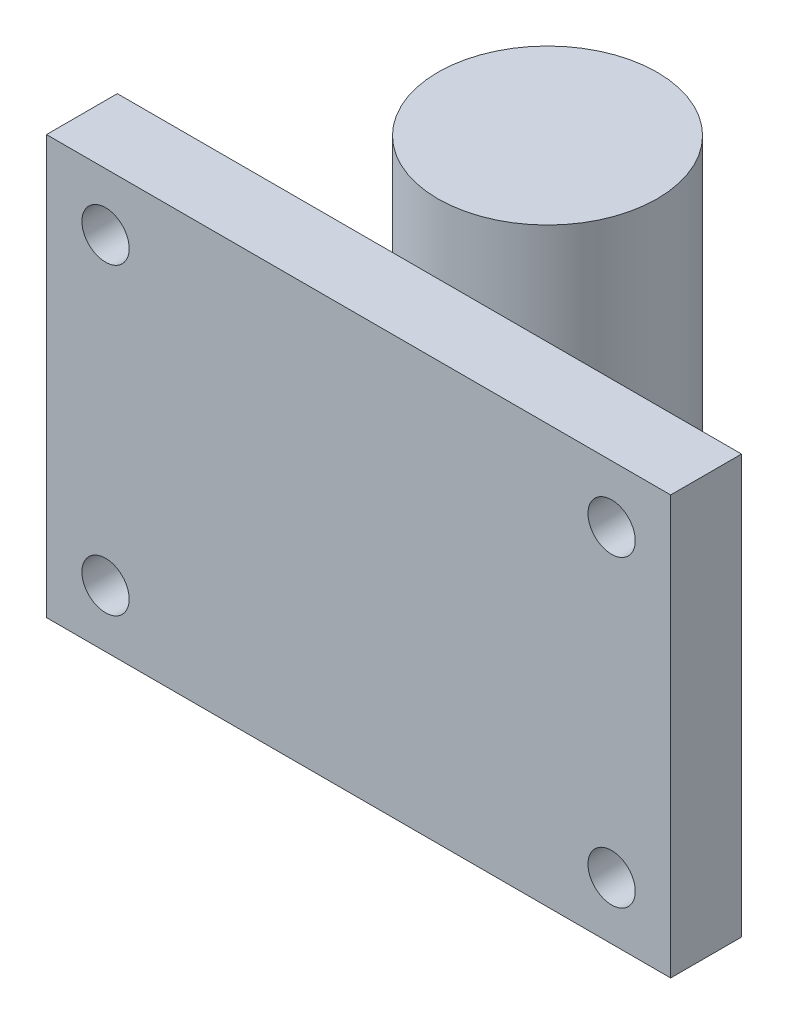
ISO-10303-21;
HEADER;
FILE_DESCRIPTION(('STEP AP214'),'2;1');
FILE_NAME('part.step','',(''),(''),'','','');
FILE_SCHEMA(('AUTOMOTIVE_DESIGN { 1 0 10303 214 1 1 1 1 }'));
ENDSEC;
DATA;
#1=APPLICATION_CONTEXT('core data for automotive mechanical design processes');
#2=APPLICATION_PROTOCOL_DEFINITION('international standard','automotive_design',2000,#1);
#3=PRODUCT_CONTEXT('',#1,'mechanical');
#4=PRODUCT('Part','Part','',(#3));
#5=PRODUCT_RELATED_PRODUCT_CATEGORY('part','',(#4));
#6=PRODUCT_DEFINITION_FORMATION('','',#4);
#7=PRODUCT_DEFINITION_CONTEXT('part definition',#1,'design');
#8=PRODUCT_DEFINITION('design','',#6,#7);
#9=PRODUCT_DEFINITION_SHAPE('','',#8);
#10=(LENGTH_UNIT() NAMED_UNIT(*) SI_UNIT(.MILLI.,.METRE.));
#11=(NAMED_UNIT(*) PLANE_ANGLE_UNIT() SI_UNIT($,.RADIAN.));
#12=(NAMED_UNIT(*) SI_UNIT($,.STERADIAN.) SOLID_ANGLE_UNIT());
#13=UNCERTAINTY_MEASURE_WITH_UNIT(LENGTH_MEASURE(1.E-05),#10,'distance_accuracy_value','');
#14=(GEOMETRIC_REPRESENTATION_CONTEXT(3) GLOBAL_UNCERTAINTY_ASSIGNED_CONTEXT((#13)) GLOBAL_UNIT_ASSIGNED_CONTEXT((#10,
#11,#12)) REPRESENTATION_CONTEXT('',''));
#15=CARTESIAN_POINT('',(0.,0.,0.));
#16=DIRECTION('',(0.,0.,1.));
#17=DIRECTION('',(1.,0.,0.));
#18=AXIS2_PLACEMENT_3D('',#15,#16,#17);
#19=CARTESIAN_POINT('',(-79.1952825717621,15.,-45.2352121632585));
#20=DIRECTION('',(0.,-1.,0.));
#21=DIRECTION('',(0.,0.,-1.));
#22=AXIS2_PLACEMENT_3D('',#19,#20,#21);
#23=CYLINDRICAL_SURFACE('',#22,59.8539438578218);
#24=DIRECTION('',(0.,-1.,0.));
#25=VECTOR('',#24,1.);
#26=CARTESIAN_POINT('',(-26.7037049336842,0.,-16.4753638952143));
#27=LINE('',#26,#25);
#28=CARTESIAN_POINT('',(-26.7037049336842,-15.,-16.4753638952143));
#29=VERTEX_POINT('',#28);
#30=CARTESIAN_POINT('',(-26.7037049336842,15.,-16.4753638952143));
#31=VERTEX_POINT('',#30);
#32=EDGE_CURVE('E111',#29,#31,#27,.F.);
#33=ORIENTED_EDGE('',*,*,#32,.F.);
#34=CARTESIAN_POINT('',(-79.1952825717621,-15.,-45.2352121632585));
#35=DIRECTION('',(0.,-1.,0.));
#36=DIRECTION('',(0.,0.,-1.));
#37=AXIS2_PLACEMENT_3D('',#34,#35,#36);
#38=CIRCLE('',#37,59.8539438578218);
#39=CARTESIAN_POINT('',(-40.,-15.,0.));
#40=VERTEX_POINT('',#39);
#41=EDGE_CURVE('E101',#29,#40,#38,.T.);
#42=ORIENTED_EDGE('',*,*,#41,.T.);
#43=DIRECTION('',(0.,-1.,0.));
#44=VECTOR('',#43,1.);
#45=CARTESIAN_POINT('',(-40.,15.,0.));
#46=LINE('',#45,#44);
#47=CARTESIAN_POINT('',(-40.,15.,0.));
#48=VERTEX_POINT('',#47);
#49=EDGE_CURVE('E136',#48,#40,#46,.T.);
#50=ORIENTED_EDGE('',*,*,#49,.F.);
#51=CARTESIAN_POINT('',(-79.1952825717621,15.,-45.2352121632585));
#52=DIRECTION('',(0.,-1.,0.));
#53=DIRECTION('',(0.,0.,-1.));
#54=AXIS2_PLACEMENT_3D('',#51,#52,#53);
#55=CIRCLE('',#54,59.8539438578218);
#56=EDGE_CURVE('E112',#31,#48,#55,.T.);
#57=ORIENTED_EDGE('',*,*,#56,.F.);
#58=EDGE_LOOP('',(#33,#42,#50,#57));
#59=FACE_BOUND('',#58,.T.);
#60=ADVANCED_FACE('F35',(#59),#23,.F.);
#61=CARTESIAN_POINT('',(79.1952825717621,15.,-45.2352121632585));
#62=DIRECTION('',(0.,-1.,0.));
#63=DIRECTION('',(0.,0.,-1.));
#64=AXIS2_PLACEMENT_3D('',#61,#62,#63);
#65=CYLINDRICAL_SURFACE('',#64,59.8539438578218);
#66=DIRECTION('',(0.,-1.,0.));
#67=VECTOR('',#66,1.);
#68=CARTESIAN_POINT('',(26.7037049336842,0.,-16.4753638952143));
#69=LINE('',#68,#67);
#70=CARTESIAN_POINT('',(26.7037049336842,15.,-16.4753638952143));
#71=VERTEX_POINT('',#70);
#72=CARTESIAN_POINT('',(26.7037049336842,-15.,-16.4753638952143));
#73=VERTEX_POINT('',#72);
#74=EDGE_CURVE('E50',#71,#73,#69,.T.);
#75=ORIENTED_EDGE('',*,*,#74,.F.);
#76=CARTESIAN_POINT('',(79.1952825717621,15.,-45.2352121632585));
#77=DIRECTION('',(0.,-1.,0.));
#78=DIRECTION('',(0.,0.,1.));
#79=AXIS2_PLACEMENT_3D('',#76,#77,#78);
#80=CIRCLE('',#79,59.8539438578218);
#81=CARTESIAN_POINT('',(40.,15.,0.));
#82=VERTEX_POINT('',#81);
#83=EDGE_CURVE('E129',#82,#71,#80,.T.);
#84=ORIENTED_EDGE('',*,*,#83,.F.);
#85=DIRECTION('',(0.,-1.,0.));
#86=VECTOR('',#85,1.);
#87=CARTESIAN_POINT('',(40.,15.,0.));
#88=LINE('',#87,#86);
#89=CARTESIAN_POINT('',(40.,-15.,0.));
#90=VERTEX_POINT('',#89);
#91=EDGE_CURVE('E130',#82,#90,#88,.T.);
#92=ORIENTED_EDGE('',*,*,#91,.T.);
#93=CARTESIAN_POINT('',(79.1952825717621,-15.,-45.2352121632585));
#94=DIRECTION('',(0.,-1.,0.));
#95=DIRECTION('',(0.,0.,1.));
#96=AXIS2_PLACEMENT_3D('',#93,#94,#95);
#97=CIRCLE('',#96,59.8539438578218);
#98=EDGE_CURVE('E127',#90,#73,#97,.T.);
#99=ORIENTED_EDGE('',*,*,#98,.T.);
#100=EDGE_LOOP('',(#75,#84,#92,#99));
#101=FACE_BOUND('',#100,.T.);
#102=ADVANCED_FACE('F201',(#101),#65,.F.);
#103=CARTESIAN_POINT('',(92.5,-62.,21.));
#104=DIRECTION('',(-1.,0.,0.));
#105=DIRECTION('',(0.,0.,1.));
#106=AXIS2_PLACEMENT_3D('',#103,#104,#105);
#107=PLANE('',#106);
#108=DIRECTION('',(0.,1.,0.));
#109=VECTOR('',#108,1.);
#110=CARTESIAN_POINT('',(92.5,-62.,0.));
#111=LINE('',#110,#109);
#112=CARTESIAN_POINT('',(92.5,-62.,0.));
#113=VERTEX_POINT('',#112);
#114=CARTESIAN_POINT('',(92.5,62.,0.));
#115=VERTEX_POINT('',#114);
#116=EDGE_CURVE('E138',#113,#115,#111,.T.);
#117=ORIENTED_EDGE('',*,*,#116,.T.);
#118=DIRECTION('',(0.,0.,-1.));
#119=VECTOR('',#118,1.);
#120=CARTESIAN_POINT('',(92.5,62.,21.));
#121=LINE('',#120,#119);
#122=CARTESIAN_POINT('',(92.5,62.,21.));
#123=VERTEX_POINT('',#122);
#124=EDGE_CURVE('E43',#123,#115,#121,.T.);
#125=ORIENTED_EDGE('',*,*,#124,.F.);
#126=DIRECTION('',(0.,1.,0.));
#127=VECTOR('',#126,1.);
#128=CARTESIAN_POINT('',(92.5,-62.,21.));
#129=LINE('',#128,#127);
#130=CARTESIAN_POINT('',(92.5,-62.,21.));
#131=VERTEX_POINT('',#130);
#132=EDGE_CURVE('E139',#131,#123,#129,.T.);
#133=ORIENTED_EDGE('',*,*,#132,.F.);
#134=DIRECTION('',(0.,0.,-1.));
#135=VECTOR('',#134,1.);
#136=CARTESIAN_POINT('',(92.5,-62.,21.));
#137=LINE('',#136,#135);
#138=EDGE_CURVE('E149',#131,#113,#137,.T.);
#139=ORIENTED_EDGE('',*,*,#138,.T.);
#140=EDGE_LOOP('',(#117,#125,#133,#139));
#141=FACE_BOUND('',#140,.T.);
#142=ADVANCED_FACE('F37',(#141),#107,.F.);
#143=CARTESIAN_POINT('',(-92.5,62.,21.));
#144=DIRECTION('',(0.,-1.,0.));
#145=DIRECTION('',(0.,0.,-1.));
#146=AXIS2_PLACEMENT_3D('',#143,#144,#145);
#147=PLANE('',#146);
#148=DIRECTION('',(-1.,0.,0.));
#149=VECTOR('',#148,1.);
#150=CARTESIAN_POINT('',(-92.5,62.,0.));
#151=LINE('',#150,#149);
#152=CARTESIAN_POINT('',(-92.5,62.,0.));
#153=VERTEX_POINT('',#152);
#154=EDGE_CURVE('E152',#115,#153,#151,.T.);
#155=ORIENTED_EDGE('',*,*,#154,.T.);
#156=DIRECTION('',(0.,0.,-1.));
#157=VECTOR('',#156,1.);
#158=CARTESIAN_POINT('',(-92.5,62.,21.));
#159=LINE('',#158,#157);
#160=CARTESIAN_POINT('',(-92.5,62.,21.));
#161=VERTEX_POINT('',#160);
#162=EDGE_CURVE('E162',#161,#153,#159,.T.);
#163=ORIENTED_EDGE('',*,*,#162,.F.);
#164=DIRECTION('',(-1.,0.,0.));
#165=VECTOR('',#164,1.);
#166=CARTESIAN_POINT('',(-92.5,62.,21.));
#167=LINE('',#166,#165);
#168=EDGE_CURVE('E142',#123,#161,#167,.T.);
#169=ORIENTED_EDGE('',*,*,#168,.F.);
#170=ORIENTED_EDGE('',*,*,#124,.T.);
#171=EDGE_LOOP('',(#155,#163,#169,#170));
#172=FACE_BOUND('',#171,.T.);
#173=ADVANCED_FACE('F167',(#172),#147,.F.);
#174=CARTESIAN_POINT('',(-92.5,-62.,21.));
#175=DIRECTION('',(1.,0.,0.));
#176=DIRECTION('',(0.,0.,-1.));
#177=AXIS2_PLACEMENT_3D('',#174,#175,#176);
#178=PLANE('',#177);
#179=DIRECTION('',(0.,-1.,0.));
#180=VECTOR('',#179,1.);
#181=CARTESIAN_POINT('',(-92.5,-62.,0.));
#182=LINE('',#181,#180);
#183=CARTESIAN_POINT('',(-92.5,-62.,0.));
#184=VERTEX_POINT('',#183);
#185=EDGE_CURVE('E154',#153,#184,#182,.T.);
#186=ORIENTED_EDGE('',*,*,#185,.T.);
#187=DIRECTION('',(0.,0.,-1.));
#188=VECTOR('',#187,1.);
#189=CARTESIAN_POINT('',(-92.5,-62.,21.));
#190=LINE('',#189,#188);
#191=CARTESIAN_POINT('',(-92.5,-62.,21.));
#192=VERTEX_POINT('',#191);
#193=EDGE_CURVE('E159',#192,#184,#190,.T.);
#194=ORIENTED_EDGE('',*,*,#193,.F.);
#195=DIRECTION('',(0.,-1.,0.));
#196=VECTOR('',#195,1.);
#197=CARTESIAN_POINT('',(-92.5,-62.,21.));
#198=LINE('',#197,#196);
#199=EDGE_CURVE('E145',#161,#192,#198,.T.);
#200=ORIENTED_EDGE('',*,*,#199,.F.);
#201=ORIENTED_EDGE('',*,*,#162,.T.);
#202=EDGE_LOOP('',(#186,#194,#200,#201));
#203=FACE_BOUND('',#202,.T.);
#204=ADVANCED_FACE('F179',(#203),#178,.F.);
#205=CARTESIAN_POINT('',(-92.5,-62.,21.));
#206=DIRECTION('',(0.,1.,0.));
#207=DIRECTION('',(0.,0.,1.));
#208=AXIS2_PLACEMENT_3D('',#205,#206,#207);
#209=PLANE('',#208);
#210=DIRECTION('',(1.,0.,0.));
#211=VECTOR('',#210,1.);
#212=CARTESIAN_POINT('',(-92.5,-62.,0.));
#213=LINE('',#212,#211);
#214=EDGE_CURVE('E143',#184,#113,#213,.T.);
#215=ORIENTED_EDGE('',*,*,#214,.T.);
#216=ORIENTED_EDGE('',*,*,#138,.F.);
#217=DIRECTION('',(1.,0.,0.));
#218=VECTOR('',#217,1.);
#219=CARTESIAN_POINT('',(-92.5,-62.,21.));
#220=LINE('',#219,#218);
#221=EDGE_CURVE('E147',#192,#131,#220,.T.);
#222=ORIENTED_EDGE('',*,*,#221,.F.);
#223=ORIENTED_EDGE('',*,*,#193,.T.);
#224=EDGE_LOOP('',(#215,#216,#222,#223));
#225=FACE_BOUND('',#224,.T.);
#226=ADVANCED_FACE('F183',(#225),#209,.F.);
#227=CARTESIAN_POINT('',(0.,0.,21.));
#228=DIRECTION('',(0.,0.,-1.));
#229=DIRECTION('',(-1.,0.,0.));
#230=AXIS2_PLACEMENT_3D('',#227,#228,#229);
#231=PLANE('',#230);
#232=CARTESIAN_POINT('',(-75.,45.,21.));
#233=DIRECTION('',(0.,0.,-1.));
#234=DIRECTION('',(-1.,0.,0.));
#235=AXIS2_PLACEMENT_3D('',#232,#233,#234);
#236=CIRCLE('',#235,7.);
#237=CARTESIAN_POINT('',(-82.,45.,21.));
#238=VERTEX_POINT('',#237);
#239=EDGE_CURVE('E240',#238,#238,#236,.T.);
#240=ORIENTED_EDGE('',*,*,#239,.T.);
#241=EDGE_LOOP('',(#240));
#242=FACE_BOUND('',#241,.T.);
#243=CARTESIAN_POINT('',(-75.,-45.,21.));
#244=DIRECTION('',(0.,0.,-1.));
#245=DIRECTION('',(-1.,0.,0.));
#246=AXIS2_PLACEMENT_3D('',#243,#244,#245);
#247=CIRCLE('',#246,7.);
#248=CARTESIAN_POINT('',(-82.,-45.,21.));
#249=VERTEX_POINT('',#248);
#250=EDGE_CURVE('E244',#249,#249,#247,.T.);
#251=ORIENTED_EDGE('',*,*,#250,.T.);
#252=EDGE_LOOP('',(#251));
#253=FACE_BOUND('',#252,.T.);
#254=CARTESIAN_POINT('',(75.,-45.,21.));
#255=DIRECTION('',(0.,0.,-1.));
#256=DIRECTION('',(-1.,0.,0.));
#257=AXIS2_PLACEMENT_3D('',#254,#255,#256);
#258=CIRCLE('',#257,7.);
#259=CARTESIAN_POINT('',(68.,-45.,21.));
#260=VERTEX_POINT('',#259);
#261=EDGE_CURVE('E254',#260,#260,#258,.T.);
#262=ORIENTED_EDGE('',*,*,#261,.T.);
#263=EDGE_LOOP('',(#262));
#264=FACE_BOUND('',#263,.T.);
#265=CARTESIAN_POINT('',(75.,45.,21.));
#266=DIRECTION('',(0.,0.,-1.));
#267=DIRECTION('',(-1.,0.,0.));
#268=AXIS2_PLACEMENT_3D('',#265,#266,#267);
#269=CIRCLE('',#268,7.);
#270=CARTESIAN_POINT('',(68.,45.,21.));
#271=VERTEX_POINT('',#270);
#272=EDGE_CURVE('E260',#271,#271,#269,.T.);
#273=ORIENTED_EDGE('',*,*,#272,.T.);
#274=EDGE_LOOP('',(#273));
#275=FACE_BOUND('',#274,.T.);
#276=ORIENTED_EDGE('',*,*,#132,.T.);
#277=ORIENTED_EDGE('',*,*,#168,.T.);
#278=ORIENTED_EDGE('',*,*,#199,.T.);
#279=ORIENTED_EDGE('',*,*,#221,.T.);
#280=EDGE_LOOP('',(#276,#277,#278,#279));
#281=FACE_BOUND('',#280,.T.);
#282=ADVANCED_FACE('F185',(#242,#253,#264,#275,#281),#231,.F.);
#283=CARTESIAN_POINT('',(0.,0.,0.));
#284=DIRECTION('',(0.,0.,-1.));
#285=DIRECTION('',(-1.,0.,0.));
#286=AXIS2_PLACEMENT_3D('',#283,#284,#285);
#287=PLANE('',#286);
#288=CARTESIAN_POINT('',(-75.,45.,0.));
#289=DIRECTION('',(0.,0.,-1.));
#290=DIRECTION('',(-1.,0.,0.));
#291=AXIS2_PLACEMENT_3D('',#288,#289,#290);
#292=CIRCLE('',#291,7.);
#293=CARTESIAN_POINT('',(-82.,45.,0.));
#294=VERTEX_POINT('',#293);
#295=EDGE_CURVE('E243',#294,#294,#292,.T.);
#296=ORIENTED_EDGE('',*,*,#295,.F.);
#297=EDGE_LOOP('',(#296));
#298=FACE_BOUND('',#297,.T.);
#299=CARTESIAN_POINT('',(-75.,-45.,0.));
#300=DIRECTION('',(0.,0.,-1.));
#301=DIRECTION('',(-1.,0.,0.));
#302=AXIS2_PLACEMENT_3D('',#299,#300,#301);
#303=CIRCLE('',#302,7.);
#304=CARTESIAN_POINT('',(-82.,-45.,0.));
#305=VERTEX_POINT('',#304);
#306=EDGE_CURVE('E249',#305,#305,#303,.T.);
#307=ORIENTED_EDGE('',*,*,#306,.F.);
#308=EDGE_LOOP('',(#307));
#309=FACE_BOUND('',#308,.T.);
#310=CARTESIAN_POINT('',(75.,-45.,0.));
#311=DIRECTION('',(0.,0.,-1.));
#312=DIRECTION('',(-1.,0.,0.));
#313=AXIS2_PLACEMENT_3D('',#310,#311,#312);
#314=CIRCLE('',#313,7.);
#315=CARTESIAN_POINT('',(68.,-45.,0.));
#316=VERTEX_POINT('',#315);
#317=EDGE_CURVE('E257',#316,#316,#314,.T.);
#318=ORIENTED_EDGE('',*,*,#317,.F.);
#319=EDGE_LOOP('',(#318));
#320=FACE_BOUND('',#319,.T.);
#321=CARTESIAN_POINT('',(75.,45.,0.));
#322=DIRECTION('',(0.,0.,-1.));
#323=DIRECTION('',(-1.,0.,0.));
#324=AXIS2_PLACEMENT_3D('',#321,#322,#323);
#325=CIRCLE('',#324,7.);
#326=CARTESIAN_POINT('',(68.,45.,0.));
#327=VERTEX_POINT('',#326);
#328=EDGE_CURVE('E246',#327,#327,#325,.T.);
#329=ORIENTED_EDGE('',*,*,#328,.F.);
#330=EDGE_LOOP('',(#329));
#331=FACE_BOUND('',#330,.T.);
#332=DIRECTION('',(1.,0.,0.));
#333=VECTOR('',#332,1.);
#334=CARTESIAN_POINT('',(40.,15.,0.));
#335=LINE('',#334,#333);
#336=EDGE_CURVE('E126',#48,#82,#335,.T.);
#337=ORIENTED_EDGE('',*,*,#336,.F.);
#338=ORIENTED_EDGE('',*,*,#49,.T.);
#339=DIRECTION('',(1.,0.,0.));
#340=VECTOR('',#339,1.);
#341=CARTESIAN_POINT('',(40.,-15.,0.));
#342=LINE('',#341,#340);
#343=EDGE_CURVE('E105',#40,#90,#342,.T.);
#344=ORIENTED_EDGE('',*,*,#343,.T.);
#345=ORIENTED_EDGE('',*,*,#91,.F.);
#346=EDGE_LOOP('',(#337,#338,#344,#345));
#347=FACE_BOUND('',#346,.T.);
#348=ORIENTED_EDGE('',*,*,#116,.F.);
#349=ORIENTED_EDGE('',*,*,#214,.F.);
#350=ORIENTED_EDGE('',*,*,#185,.F.);
#351=ORIENTED_EDGE('',*,*,#154,.F.);
#352=EDGE_LOOP('',(#348,#349,#350,#351));
#353=FACE_BOUND('',#352,.T.);
#354=ADVANCED_FACE('F175',(#298,#309,#320,#331,#347,#353),#287,.T.);
#355=CARTESIAN_POINT('',(0.,15.,-35.));
#356=DIRECTION('',(0.,1.,0.));
#357=DIRECTION('',(0.,0.,1.));
#358=AXIS2_PLACEMENT_3D('',#355,#356,#357);
#359=PLANE('',#358);
#360=ORIENTED_EDGE('',*,*,#83,.T.);
#361=CARTESIAN_POINT('',(0.,15.,-35.));
#362=DIRECTION('',(0.,1.,0.));
#363=DIRECTION('',(0.,0.,1.));
#364=AXIS2_PLACEMENT_3D('',#361,#362,#363);
#365=CIRCLE('',#364,32.5);
#366=EDGE_CURVE('E57',#71,#31,#365,.F.);
#367=ORIENTED_EDGE('',*,*,#366,.T.);
#368=ORIENTED_EDGE('',*,*,#56,.T.);
#369=ORIENTED_EDGE('',*,*,#336,.T.);
#370=EDGE_LOOP('',(#360,#367,#368,#369));
#371=FACE_BOUND('',#370,.T.);
#372=ADVANCED_FACE('F193',(#371),#359,.T.);
#373=CARTESIAN_POINT('',(0.,-15.,-35.));
#374=DIRECTION('',(0.,1.,0.));
#375=DIRECTION('',(0.,0.,1.));
#376=AXIS2_PLACEMENT_3D('',#373,#374,#375);
#377=PLANE('',#376);
#378=CARTESIAN_POINT('',(0.,-15.,-35.));
#379=DIRECTION('',(0.,1.,0.));
#380=DIRECTION('',(0.,0.,1.));
#381=AXIS2_PLACEMENT_3D('',#378,#379,#380);
#382=CIRCLE('',#381,32.5);
#383=EDGE_CURVE('E11',#73,#29,#382,.F.);
#384=ORIENTED_EDGE('',*,*,#383,.F.);
#385=ORIENTED_EDGE('',*,*,#98,.F.);
#386=ORIENTED_EDGE('',*,*,#343,.F.);
#387=ORIENTED_EDGE('',*,*,#41,.F.);
#388=EDGE_LOOP('',(#384,#385,#386,#387));
#389=FACE_BOUND('',#388,.T.);
#390=ADVANCED_FACE('F103',(#389),#377,.F.);
#391=CARTESIAN_POINT('',(0.,80.,-35.));
#392=DIRECTION('',(0.,-1.,0.));
#393=DIRECTION('',(0.,0.,-1.));
#394=AXIS2_PLACEMENT_3D('',#391,#392,#393);
#395=CYLINDRICAL_SURFACE('',#394,32.5);
#396=ORIENTED_EDGE('',*,*,#366,.F.);
#397=ORIENTED_EDGE('',*,*,#74,.T.);
#398=ORIENTED_EDGE('',*,*,#383,.T.);
#399=ORIENTED_EDGE('',*,*,#32,.T.);
#400=EDGE_LOOP('',(#396,#397,#398,#399));
#401=FACE_BOUND('',#400,.T.);
#402=CARTESIAN_POINT('',(0.,80.,-35.));
#403=DIRECTION('',(0.,1.,0.));
#404=DIRECTION('',(0.,0.,1.));
#405=AXIS2_PLACEMENT_3D('',#402,#403,#404);
#406=CIRCLE('',#405,32.5);
#407=CARTESIAN_POINT('',(0.,80.,-2.5));
#408=VERTEX_POINT('',#407);
#409=EDGE_CURVE('E117',#408,#408,#406,.T.);
#410=ORIENTED_EDGE('',*,*,#409,.F.);
#411=EDGE_LOOP('',(#410));
#412=FACE_BOUND('',#411,.T.);
#413=CARTESIAN_POINT('',(0.,-80.,-35.));
#414=DIRECTION('',(0.,1.,0.));
#415=DIRECTION('',(0.,0.,1.));
#416=AXIS2_PLACEMENT_3D('',#413,#414,#415);
#417=CIRCLE('',#416,32.5);
#418=CARTESIAN_POINT('',(0.,-80.,-2.5));
#419=VERTEX_POINT('',#418);
#420=EDGE_CURVE('E120',#419,#419,#417,.T.);
#421=ORIENTED_EDGE('',*,*,#420,.T.);
#422=EDGE_LOOP('',(#421));
#423=FACE_BOUND('',#422,.T.);
#424=ADVANCED_FACE('F115',(#401,#412,#423),#395,.T.);
#425=CARTESIAN_POINT('',(0.,80.,-35.));
#426=DIRECTION('',(0.,1.,0.));
#427=DIRECTION('',(0.,0.,1.));
#428=AXIS2_PLACEMENT_3D('',#425,#426,#427);
#429=PLANE('',#428);
#430=ORIENTED_EDGE('',*,*,#409,.T.);
#431=EDGE_LOOP('',(#430));
#432=FACE_BOUND('',#431,.T.);
#433=ADVANCED_FACE('F213',(#432),#429,.T.);
#434=CARTESIAN_POINT('',(0.,-80.,-35.));
#435=DIRECTION('',(0.,1.,0.));
#436=DIRECTION('',(0.,0.,1.));
#437=AXIS2_PLACEMENT_3D('',#434,#435,#436);
#438=PLANE('',#437);
#439=ORIENTED_EDGE('',*,*,#420,.F.);
#440=EDGE_LOOP('',(#439));
#441=FACE_BOUND('',#440,.T.);
#442=ADVANCED_FACE('F214',(#441),#438,.F.);
#443=CARTESIAN_POINT('',(75.,45.,21.));
#444=DIRECTION('',(0.,0.,-1.));
#445=DIRECTION('',(-1.,0.,0.));
#446=AXIS2_PLACEMENT_3D('',#443,#444,#445);
#447=CYLINDRICAL_SURFACE('',#446,7.);
#448=CARTESIAN_POINT('',(68.,45.,21.));
#449=CARTESIAN_POINT('',(68.,45.,20.78125));
#450=CARTESIAN_POINT('',(68.,45.,20.5625));
#451=CARTESIAN_POINT('',(68.,45.,20.125));
#452=CARTESIAN_POINT('',(68.,45.,19.90625));
#453=CARTESIAN_POINT('',(68.,45.,19.46875));
#454=CARTESIAN_POINT('',(68.,45.,19.25));
#455=CARTESIAN_POINT('',(68.,45.,18.8125));
#456=CARTESIAN_POINT('',(68.,45.,18.59375));
#457=CARTESIAN_POINT('',(68.,45.,18.15625));
#458=CARTESIAN_POINT('',(68.,45.,17.9375));
#459=CARTESIAN_POINT('',(68.,45.,17.5));
#460=CARTESIAN_POINT('',(68.,45.,17.28125));
#461=CARTESIAN_POINT('',(68.,45.,16.84375));
#462=CARTESIAN_POINT('',(68.,45.,16.625));
#463=CARTESIAN_POINT('',(68.,45.,16.1875));
#464=CARTESIAN_POINT('',(68.,45.,15.96875));
#465=CARTESIAN_POINT('',(68.,45.,15.53125));
#466=CARTESIAN_POINT('',(68.,45.,15.3125));
#467=CARTESIAN_POINT('',(68.,45.,14.875));
#468=CARTESIAN_POINT('',(68.,45.,14.65625));
#469=CARTESIAN_POINT('',(68.,45.,14.21875));
#470=CARTESIAN_POINT('',(68.,45.,14.));
#471=CARTESIAN_POINT('',(68.,45.,13.5625));
#472=CARTESIAN_POINT('',(68.,45.,13.34375));
#473=CARTESIAN_POINT('',(68.,45.,12.90625));
#474=CARTESIAN_POINT('',(68.,45.,12.6875));
#475=CARTESIAN_POINT('',(68.,45.,12.25));
#476=CARTESIAN_POINT('',(68.,45.,12.03125));
#477=CARTESIAN_POINT('',(68.,45.,11.59375));
#478=CARTESIAN_POINT('',(68.,45.,11.375));
#479=CARTESIAN_POINT('',(68.,45.,10.9375));
#480=CARTESIAN_POINT('',(68.,45.,10.71875));
#481=CARTESIAN_POINT('',(68.,45.,10.28125));
#482=CARTESIAN_POINT('',(68.,45.,10.0625));
#483=CARTESIAN_POINT('',(68.,45.,9.625));
#484=CARTESIAN_POINT('',(68.,45.,9.40625));
#485=CARTESIAN_POINT('',(68.,45.,8.96875));
#486=CARTESIAN_POINT('',(68.,45.,8.75));
#487=CARTESIAN_POINT('',(68.,45.,8.3125));
#488=CARTESIAN_POINT('',(68.,45.,8.09375));
#489=CARTESIAN_POINT('',(68.,45.,7.65625));
#490=CARTESIAN_POINT('',(68.,45.,7.4375));
#491=CARTESIAN_POINT('',(68.,45.,7.));
#492=CARTESIAN_POINT('',(68.,45.,6.78125));
#493=CARTESIAN_POINT('',(68.,45.,6.34375));
#494=CARTESIAN_POINT('',(68.,45.,6.125));
#495=CARTESIAN_POINT('',(68.,45.,5.6875));
#496=CARTESIAN_POINT('',(68.,45.,5.46875));
#497=CARTESIAN_POINT('',(68.,45.,5.03125));
#498=CARTESIAN_POINT('',(68.,45.,4.8125));
#499=CARTESIAN_POINT('',(68.,45.,4.375));
#500=CARTESIAN_POINT('',(68.,45.,4.15625));
#501=CARTESIAN_POINT('',(68.,45.,3.71875));
#502=CARTESIAN_POINT('',(68.,45.,3.5));
#503=CARTESIAN_POINT('',(68.,45.,3.0625));
#504=CARTESIAN_POINT('',(68.,45.,2.84375));
#505=CARTESIAN_POINT('',(68.,45.,2.40625));
#506=CARTESIAN_POINT('',(68.,45.,2.1875));
#507=CARTESIAN_POINT('',(68.,45.,1.75));
#508=CARTESIAN_POINT('',(68.,45.,1.53125));
#509=CARTESIAN_POINT('',(68.,45.,1.09375));
#510=CARTESIAN_POINT('',(68.,45.,0.875000000000001));
#511=CARTESIAN_POINT('',(68.,45.,0.4375));
#512=CARTESIAN_POINT('',(68.,45.,0.21875));
#513=CARTESIAN_POINT('',(68.,45.,0.));
#514=B_SPLINE_CURVE_WITH_KNOTS('',3,(#448,#449,#450,#451,#452,#453,#454,#455,#456,#457,#458,
#459,#460,#461,#462,#463,#464,#465,#466,#467,#468,#469,#470,#471,#472,#473,#474,#475,#476,#477,
#478,#479,#480,#481,#482,#483,#484,#485,#486,#487,#488,#489,#490,#491,#492,#493,#494,#495,#496,
#497,#498,#499,#500,#501,#502,#503,#504,#505,#506,#507,#508,#509,#510,#511,#512,#513),
.UNSPECIFIED.,.F.,.F.,(4,2,2,2,2,2,2,2,2,2,2,2,2,2,2,2,2,2,2,2,2,2,2,2,2,2,2,2,2,2,2,2,4),(0.,
0.656249999999997,1.3125,1.96875,2.625,3.28125,3.9375,4.59375,5.25,5.90625,6.5625,7.21875,7.875,
8.53125,9.1875,9.84375,10.5,11.15625,11.8125,12.46875,13.125,13.78125,14.4375,15.09375,15.75,
16.40625,17.0625,17.71875,18.375,19.03125,19.6875,20.34375,21.),.UNSPECIFIED.);
#515=EDGE_CURVE('BSEAM217',#271,#327,#514,.T.);
#516=ORIENTED_EDGE('',*,*,#272,.F.);
#517=ORIENTED_EDGE('',*,*,#328,.T.);
#518=ORIENTED_EDGE('',*,*,#515,.T.);
#519=ORIENTED_EDGE('',*,*,#515,.F.);
#520=EDGE_LOOP('',(#516,#518,#517,#519));
#521=FACE_BOUND('',#520,.T.);
#522=ADVANCED_FACE('F217',(#521),#447,.F.);
#523=CARTESIAN_POINT('',(75.,-45.,21.));
#524=DIRECTION('',(0.,0.,-1.));
#525=DIRECTION('',(-1.,0.,0.));
#526=AXIS2_PLACEMENT_3D('',#523,#524,#525);
#527=CYLINDRICAL_SURFACE('',#526,7.);
#528=CARTESIAN_POINT('',(68.,-45.,21.));
#529=CARTESIAN_POINT('',(68.,-45.,20.78125));
#530=CARTESIAN_POINT('',(68.,-45.,20.5625));
#531=CARTESIAN_POINT('',(68.,-45.,20.125));
#532=CARTESIAN_POINT('',(68.,-45.,19.90625));
#533=CARTESIAN_POINT('',(68.,-45.,19.46875));
#534=CARTESIAN_POINT('',(68.,-45.,19.25));
#535=CARTESIAN_POINT('',(68.,-45.,18.8125));
#536=CARTESIAN_POINT('',(68.,-45.,18.59375));
#537=CARTESIAN_POINT('',(68.,-45.,18.15625));
#538=CARTESIAN_POINT('',(68.,-45.,17.9375));
#539=CARTESIAN_POINT('',(68.,-45.,17.5));
#540=CARTESIAN_POINT('',(68.,-45.,17.28125));
#541=CARTESIAN_POINT('',(68.,-45.,16.84375));
#542=CARTESIAN_POINT('',(68.,-45.,16.625));
#543=CARTESIAN_POINT('',(68.,-45.,16.1875));
#544=CARTESIAN_POINT('',(68.,-45.,15.96875));
#545=CARTESIAN_POINT('',(68.,-45.,15.53125));
#546=CARTESIAN_POINT('',(68.,-45.,15.3125));
#547=CARTESIAN_POINT('',(68.,-45.,14.875));
#548=CARTESIAN_POINT('',(68.,-45.,14.65625));
#549=CARTESIAN_POINT('',(68.,-45.,14.21875));
#550=CARTESIAN_POINT('',(68.,-45.,14.));
#551=CARTESIAN_POINT('',(68.,-45.,13.5625));
#552=CARTESIAN_POINT('',(68.,-45.,13.34375));
#553=CARTESIAN_POINT('',(68.,-45.,12.90625));
#554=CARTESIAN_POINT('',(68.,-45.,12.6875));
#555=CARTESIAN_POINT('',(68.,-45.,12.25));
#556=CARTESIAN_POINT('',(68.,-45.,12.03125));
#557=CARTESIAN_POINT('',(68.,-45.,11.59375));
#558=CARTESIAN_POINT('',(68.,-45.,11.375));
#559=CARTESIAN_POINT('',(68.,-45.,10.9375));
#560=CARTESIAN_POINT('',(68.,-45.,10.71875));
#561=CARTESIAN_POINT('',(68.,-45.,10.28125));
#562=CARTESIAN_POINT('',(68.,-45.,10.0625));
#563=CARTESIAN_POINT('',(68.,-45.,9.625));
#564=CARTESIAN_POINT('',(68.,-45.,9.40625));
#565=CARTESIAN_POINT('',(68.,-45.,8.96875));
#566=CARTESIAN_POINT('',(68.,-45.,8.75));
#567=CARTESIAN_POINT('',(68.,-45.,8.3125));
#568=CARTESIAN_POINT('',(68.,-45.,8.09375));
#569=CARTESIAN_POINT('',(68.,-45.,7.65625));
#570=CARTESIAN_POINT('',(68.,-45.,7.4375));
#571=CARTESIAN_POINT('',(68.,-45.,7.));
#572=CARTESIAN_POINT('',(68.,-45.,6.78125));
#573=CARTESIAN_POINT('',(68.,-45.,6.34375));
#574=CARTESIAN_POINT('',(68.,-45.,6.125));
#575=CARTESIAN_POINT('',(68.,-45.,5.6875));
#576=CARTESIAN_POINT('',(68.,-45.,5.46875));
#577=CARTESIAN_POINT('',(68.,-45.,5.03125));
#578=CARTESIAN_POINT('',(68.,-45.,4.8125));
#579=CARTESIAN_POINT('',(68.,-45.,4.375));
#580=CARTESIAN_POINT('',(68.,-45.,4.15625));
#581=CARTESIAN_POINT('',(68.,-45.,3.71875));
#582=CARTESIAN_POINT('',(68.,-45.,3.5));
#583=CARTESIAN_POINT('',(68.,-45.,3.0625));
#584=CARTESIAN_POINT('',(68.,-45.,2.84375));
#585=CARTESIAN_POINT('',(68.,-45.,2.40625));
#586=CARTESIAN_POINT('',(68.,-45.,2.1875));
#587=CARTESIAN_POINT('',(68.,-45.,1.75));
#588=CARTESIAN_POINT('',(68.,-45.,1.53125));
#589=CARTESIAN_POINT('',(68.,-45.,1.09375));
#590=CARTESIAN_POINT('',(68.,-45.,0.875000000000001));
#591=CARTESIAN_POINT('',(68.,-45.,0.4375));
#592=CARTESIAN_POINT('',(68.,-45.,0.21875));
#593=CARTESIAN_POINT('',(68.,-45.,0.));
#594=B_SPLINE_CURVE_WITH_KNOTS('',3,(#528,#529,#530,#531,#532,#533,#534,#535,#536,#537,#538,
#539,#540,#541,#542,#543,#544,#545,#546,#547,#548,#549,#550,#551,#552,#553,#554,#555,#556,#557,
#558,#559,#560,#561,#562,#563,#564,#565,#566,#567,#568,#569,#570,#571,#572,#573,#574,#575,#576,
#577,#578,#579,#580,#581,#582,#583,#584,#585,#586,#587,#588,#589,#590,#591,#592,#593),
.UNSPECIFIED.,.F.,.F.,(4,2,2,2,2,2,2,2,2,2,2,2,2,2,2,2,2,2,2,2,2,2,2,2,2,2,2,2,2,2,2,2,4),(0.,
0.656249999999997,1.3125,1.96875,2.625,3.28125,3.9375,4.59375,5.25,5.90625,6.5625,7.21875,7.875,
8.53125,9.1875,9.84375,10.5,11.15625,11.8125,12.46875,13.125,13.78125,14.4375,15.09375,15.75,
16.40625,17.0625,17.71875,18.375,19.03125,19.6875,20.34375,21.),.UNSPECIFIED.);
#595=EDGE_CURVE('BSEAM224',#260,#316,#594,.T.);
#596=ORIENTED_EDGE('',*,*,#261,.F.);
#597=ORIENTED_EDGE('',*,*,#317,.T.);
#598=ORIENTED_EDGE('',*,*,#595,.T.);
#599=ORIENTED_EDGE('',*,*,#595,.F.);
#600=EDGE_LOOP('',(#596,#598,#597,#599));
#601=FACE_BOUND('',#600,.T.);
#602=ADVANCED_FACE('F224',(#601),#527,.F.);
#603=CARTESIAN_POINT('',(-75.,-45.,21.));
#604=DIRECTION('',(0.,0.,-1.));
#605=DIRECTION('',(-1.,0.,0.));
#606=AXIS2_PLACEMENT_3D('',#603,#604,#605);
#607=CYLINDRICAL_SURFACE('',#606,7.);
#608=CARTESIAN_POINT('',(-82.,-45.,21.));
#609=CARTESIAN_POINT('',(-82.,-45.,20.78125));
#610=CARTESIAN_POINT('',(-82.,-45.,20.5625));
#611=CARTESIAN_POINT('',(-82.,-45.,20.125));
#612=CARTESIAN_POINT('',(-82.,-45.,19.90625));
#613=CARTESIAN_POINT('',(-82.,-45.,19.46875));
#614=CARTESIAN_POINT('',(-82.,-45.,19.25));
#615=CARTESIAN_POINT('',(-82.,-45.,18.8125));
#616=CARTESIAN_POINT('',(-82.,-45.,18.59375));
#617=CARTESIAN_POINT('',(-82.,-45.,18.15625));
#618=CARTESIAN_POINT('',(-82.,-45.,17.9375));
#619=CARTESIAN_POINT('',(-82.,-45.,17.5));
#620=CARTESIAN_POINT('',(-82.,-45.,17.28125));
#621=CARTESIAN_POINT('',(-82.,-45.,16.84375));
#622=CARTESIAN_POINT('',(-82.,-45.,16.625));
#623=CARTESIAN_POINT('',(-82.,-45.,16.1875));
#624=CARTESIAN_POINT('',(-82.,-45.,15.96875));
#625=CARTESIAN_POINT('',(-82.,-45.,15.53125));
#626=CARTESIAN_POINT('',(-82.,-45.,15.3125));
#627=CARTESIAN_POINT('',(-82.,-45.,14.875));
#628=CARTESIAN_POINT('',(-82.,-45.,14.65625));
#629=CARTESIAN_POINT('',(-82.,-45.,14.21875));
#630=CARTESIAN_POINT('',(-82.,-45.,14.));
#631=CARTESIAN_POINT('',(-82.,-45.,13.5625));
#632=CARTESIAN_POINT('',(-82.,-45.,13.34375));
#633=CARTESIAN_POINT('',(-82.,-45.,12.90625));
#634=CARTESIAN_POINT('',(-82.,-45.,12.6875));
#635=CARTESIAN_POINT('',(-82.,-45.,12.25));
#636=CARTESIAN_POINT('',(-82.,-45.,12.03125));
#637=CARTESIAN_POINT('',(-82.,-45.,11.59375));
#638=CARTESIAN_POINT('',(-82.,-45.,11.375));
#639=CARTESIAN_POINT('',(-82.,-45.,10.9375));
#640=CARTESIAN_POINT('',(-82.,-45.,10.71875));
#641=CARTESIAN_POINT('',(-82.,-45.,10.28125));
#642=CARTESIAN_POINT('',(-82.,-45.,10.0625));
#643=CARTESIAN_POINT('',(-82.,-45.,9.625));
#644=CARTESIAN_POINT('',(-82.,-45.,9.40625));
#645=CARTESIAN_POINT('',(-82.,-45.,8.96875));
#646=CARTESIAN_POINT('',(-82.,-45.,8.75));
#647=CARTESIAN_POINT('',(-82.,-45.,8.3125));
#648=CARTESIAN_POINT('',(-82.,-45.,8.09375));
#649=CARTESIAN_POINT('',(-82.,-45.,7.65625));
#650=CARTESIAN_POINT('',(-82.,-45.,7.4375));
#651=CARTESIAN_POINT('',(-82.,-45.,7.));
#652=CARTESIAN_POINT('',(-82.,-45.,6.78125));
#653=CARTESIAN_POINT('',(-82.,-45.,6.34375));
#654=CARTESIAN_POINT('',(-82.,-45.,6.125));
#655=CARTESIAN_POINT('',(-82.,-45.,5.6875));
#656=CARTESIAN_POINT('',(-82.,-45.,5.46875));
#657=CARTESIAN_POINT('',(-82.,-45.,5.03125));
#658=CARTESIAN_POINT('',(-82.,-45.,4.8125));
#659=CARTESIAN_POINT('',(-82.,-45.,4.375));
#660=CARTESIAN_POINT('',(-82.,-45.,4.15625));
#661=CARTESIAN_POINT('',(-82.,-45.,3.71875));
#662=CARTESIAN_POINT('',(-82.,-45.,3.5));
#663=CARTESIAN_POINT('',(-82.,-45.,3.0625));
#664=CARTESIAN_POINT('',(-82.,-45.,2.84375));
#665=CARTESIAN_POINT('',(-82.,-45.,2.40625));
#666=CARTESIAN_POINT('',(-82.,-45.,2.1875));
#667=CARTESIAN_POINT('',(-82.,-45.,1.75));
#668=CARTESIAN_POINT('',(-82.,-45.,1.53125));
#669=CARTESIAN_POINT('',(-82.,-45.,1.09375));
#670=CARTESIAN_POINT('',(-82.,-45.,0.875000000000001));
#671=CARTESIAN_POINT('',(-82.,-45.,0.4375));
#672=CARTESIAN_POINT('',(-82.,-45.,0.21875));
#673=CARTESIAN_POINT('',(-82.,-45.,0.));
#674=B_SPLINE_CURVE_WITH_KNOTS('',3,(#608,#609,#610,#611,#612,#613,#614,#615,#616,#617,#618,
#619,#620,#621,#622,#623,#624,#625,#626,#627,#628,#629,#630,#631,#632,#633,#634,#635,#636,#637,
#638,#639,#640,#641,#642,#643,#644,#645,#646,#647,#648,#649,#650,#651,#652,#653,#654,#655,#656,
#657,#658,#659,#660,#661,#662,#663,#664,#665,#666,#667,#668,#669,#670,#671,#672,#673),
.UNSPECIFIED.,.F.,.F.,(4,2,2,2,2,2,2,2,2,2,2,2,2,2,2,2,2,2,2,2,2,2,2,2,2,2,2,2,2,2,2,2,4),(0.,
0.656249999999997,1.3125,1.96875,2.625,3.28125,3.9375,4.59375,5.25,5.90625,6.5625,7.21875,7.875,
8.53125,9.1875,9.84375,10.5,11.15625,11.8125,12.46875,13.125,13.78125,14.4375,15.09375,15.75,
16.40625,17.0625,17.71875,18.375,19.03125,19.6875,20.34375,21.),.UNSPECIFIED.);
#675=EDGE_CURVE('BSEAM228',#249,#305,#674,.T.);
#676=ORIENTED_EDGE('',*,*,#250,.F.);
#677=ORIENTED_EDGE('',*,*,#306,.T.);
#678=ORIENTED_EDGE('',*,*,#675,.T.);
#679=ORIENTED_EDGE('',*,*,#675,.F.);
#680=EDGE_LOOP('',(#676,#678,#677,#679));
#681=FACE_BOUND('',#680,.T.);
#682=ADVANCED_FACE('F228',(#681),#607,.F.);
#683=CARTESIAN_POINT('',(-75.,45.,21.));
#684=DIRECTION('',(0.,0.,-1.));
#685=DIRECTION('',(-1.,0.,0.));
#686=AXIS2_PLACEMENT_3D('',#683,#684,#685);
#687=CYLINDRICAL_SURFACE('',#686,7.);
#688=CARTESIAN_POINT('',(-82.,45.,21.));
#689=CARTESIAN_POINT('',(-82.,45.,20.78125));
#690=CARTESIAN_POINT('',(-82.,45.,20.5625));
#691=CARTESIAN_POINT('',(-82.,45.,20.125));
#692=CARTESIAN_POINT('',(-82.,45.,19.90625));
#693=CARTESIAN_POINT('',(-82.,45.,19.46875));
#694=CARTESIAN_POINT('',(-82.,45.,19.25));
#695=CARTESIAN_POINT('',(-82.,45.,18.8125));
#696=CARTESIAN_POINT('',(-82.,45.,18.59375));
#697=CARTESIAN_POINT('',(-82.,45.,18.15625));
#698=CARTESIAN_POINT('',(-82.,45.,17.9375));
#699=CARTESIAN_POINT('',(-82.,45.,17.5));
#700=CARTESIAN_POINT('',(-82.,45.,17.28125));
#701=CARTESIAN_POINT('',(-82.,45.,16.84375));
#702=CARTESIAN_POINT('',(-82.,45.,16.625));
#703=CARTESIAN_POINT('',(-82.,45.,16.1875));
#704=CARTESIAN_POINT('',(-82.,45.,15.96875));
#705=CARTESIAN_POINT('',(-82.,45.,15.53125));
#706=CARTESIAN_POINT('',(-82.,45.,15.3125));
#707=CARTESIAN_POINT('',(-82.,45.,14.875));
#708=CARTESIAN_POINT('',(-82.,45.,14.65625));
#709=CARTESIAN_POINT('',(-82.,45.,14.21875));
#710=CARTESIAN_POINT('',(-82.,45.,14.));
#711=CARTESIAN_POINT('',(-82.,45.,13.5625));
#712=CARTESIAN_POINT('',(-82.,45.,13.34375));
#713=CARTESIAN_POINT('',(-82.,45.,12.90625));
#714=CARTESIAN_POINT('',(-82.,45.,12.6875));
#715=CARTESIAN_POINT('',(-82.,45.,12.25));
#716=CARTESIAN_POINT('',(-82.,45.,12.03125));
#717=CARTESIAN_POINT('',(-82.,45.,11.59375));
#718=CARTESIAN_POINT('',(-82.,45.,11.375));
#719=CARTESIAN_POINT('',(-82.,45.,10.9375));
#720=CARTESIAN_POINT('',(-82.,45.,10.71875));
#721=CARTESIAN_POINT('',(-82.,45.,10.28125));
#722=CARTESIAN_POINT('',(-82.,45.,10.0625));
#723=CARTESIAN_POINT('',(-82.,45.,9.625));
#724=CARTESIAN_POINT('',(-82.,45.,9.40625));
#725=CARTESIAN_POINT('',(-82.,45.,8.96875));
#726=CARTESIAN_POINT('',(-82.,45.,8.75));
#727=CARTESIAN_POINT('',(-82.,45.,8.3125));
#728=CARTESIAN_POINT('',(-82.,45.,8.09375));
#729=CARTESIAN_POINT('',(-82.,45.,7.65625));
#730=CARTESIAN_POINT('',(-82.,45.,7.4375));
#731=CARTESIAN_POINT('',(-82.,45.,7.));
#732=CARTESIAN_POINT('',(-82.,45.,6.78125));
#733=CARTESIAN_POINT('',(-82.,45.,6.34375));
#734=CARTESIAN_POINT('',(-82.,45.,6.125));
#735=CARTESIAN_POINT('',(-82.,45.,5.6875));
#736=CARTESIAN_POINT('',(-82.,45.,5.46875));
#737=CARTESIAN_POINT('',(-82.,45.,5.03125));
#738=CARTESIAN_POINT('',(-82.,45.,4.8125));
#739=CARTESIAN_POINT('',(-82.,45.,4.375));
#740=CARTESIAN_POINT('',(-82.,45.,4.15625));
#741=CARTESIAN_POINT('',(-82.,45.,3.71875));
#742=CARTESIAN_POINT('',(-82.,45.,3.5));
#743=CARTESIAN_POINT('',(-82.,45.,3.0625));
#744=CARTESIAN_POINT('',(-82.,45.,2.84375));
#745=CARTESIAN_POINT('',(-82.,45.,2.40625));
#746=CARTESIAN_POINT('',(-82.,45.,2.1875));
#747=CARTESIAN_POINT('',(-82.,45.,1.75));
#748=CARTESIAN_POINT('',(-82.,45.,1.53125));
#749=CARTESIAN_POINT('',(-82.,45.,1.09375));
#750=CARTESIAN_POINT('',(-82.,45.,0.875000000000001));
#751=CARTESIAN_POINT('',(-82.,45.,0.4375));
#752=CARTESIAN_POINT('',(-82.,45.,0.21875));
#753=CARTESIAN_POINT('',(-82.,45.,0.));
#754=B_SPLINE_CURVE_WITH_KNOTS('',3,(#688,#689,#690,#691,#692,#693,#694,#695,#696,#697,#698,
#699,#700,#701,#702,#703,#704,#705,#706,#707,#708,#709,#710,#711,#712,#713,#714,#715,#716,#717,
#718,#719,#720,#721,#722,#723,#724,#725,#726,#727,#728,#729,#730,#731,#732,#733,#734,#735,#736,
#737,#738,#739,#740,#741,#742,#743,#744,#745,#746,#747,#748,#749,#750,#751,#752,#753),
.UNSPECIFIED.,.F.,.F.,(4,2,2,2,2,2,2,2,2,2,2,2,2,2,2,2,2,2,2,2,2,2,2,2,2,2,2,2,2,2,2,2,4),(0.,
0.656249999999997,1.3125,1.96875,2.625,3.28125,3.9375,4.59375,5.25,5.90625,6.5625,7.21875,7.875,
8.53125,9.1875,9.84375,10.5,11.15625,11.8125,12.46875,13.125,13.78125,14.4375,15.09375,15.75,
16.40625,17.0625,17.71875,18.375,19.03125,19.6875,20.34375,21.),.UNSPECIFIED.);
#755=EDGE_CURVE('BSEAM232',#238,#294,#754,.T.);
#756=ORIENTED_EDGE('',*,*,#239,.F.);
#757=ORIENTED_EDGE('',*,*,#295,.T.);
#758=ORIENTED_EDGE('',*,*,#755,.T.);
#759=ORIENTED_EDGE('',*,*,#755,.F.);
#760=EDGE_LOOP('',(#756,#758,#757,#759));
#761=FACE_BOUND('',#760,.T.);
#762=ADVANCED_FACE('F232',(#761),#687,.F.);
#763=CLOSED_SHELL('',(#60,#102,#142,#173,#204,#226,#282,#354,#372,#390,#424,#433,#442,#522,#602,
#682,#762));
#764=MANIFOLD_SOLID_BREP('B2',#763);
#765=ADVANCED_BREP_SHAPE_REPRESENTATION('',(#18,#764),#14);
#766=SHAPE_DEFINITION_REPRESENTATION(#9,#765);
ENDSEC;
END-ISO-10303-21;
